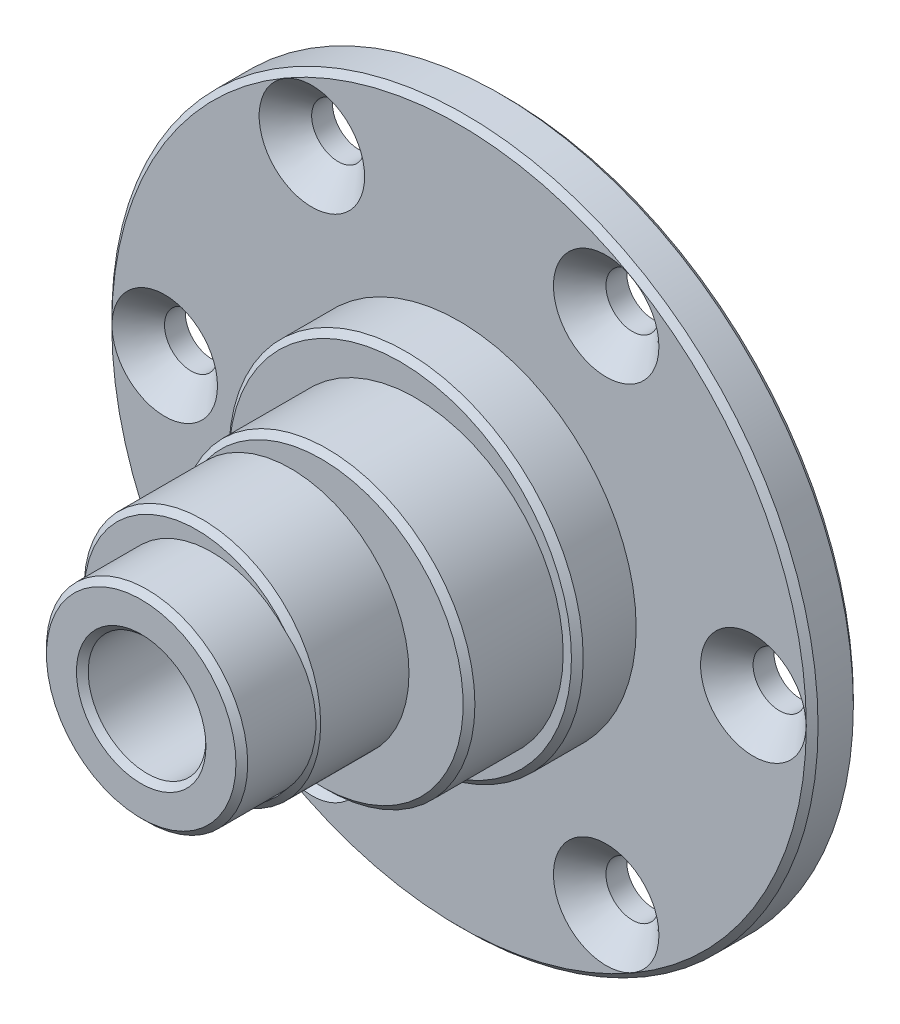
ISO-10303-21;
HEADER;
FILE_DESCRIPTION(('STEP AP214'),'2;1');
FILE_NAME('part.step','',(''),(''),'','','');
FILE_SCHEMA(('AUTOMOTIVE_DESIGN { 1 0 10303 214 1 1 1 1 }'));
ENDSEC;
DATA;
#1=APPLICATION_CONTEXT('core data for automotive mechanical design processes');
#2=APPLICATION_PROTOCOL_DEFINITION('international standard','automotive_design',2000,#1);
#3=PRODUCT_CONTEXT('',#1,'mechanical');
#4=PRODUCT('Part','Part','',(#3));
#5=PRODUCT_RELATED_PRODUCT_CATEGORY('part','',(#4));
#6=PRODUCT_DEFINITION_FORMATION('','',#4);
#7=PRODUCT_DEFINITION_CONTEXT('part definition',#1,'design');
#8=PRODUCT_DEFINITION('design','',#6,#7);
#9=PRODUCT_DEFINITION_SHAPE('','',#8);
#10=(LENGTH_UNIT() NAMED_UNIT(*) SI_UNIT(.MILLI.,.METRE.));
#11=(NAMED_UNIT(*) PLANE_ANGLE_UNIT() SI_UNIT($,.RADIAN.));
#12=(NAMED_UNIT(*) SI_UNIT($,.STERADIAN.) SOLID_ANGLE_UNIT());
#13=UNCERTAINTY_MEASURE_WITH_UNIT(LENGTH_MEASURE(1.E-05),#10,'distance_accuracy_value','');
#14=(GEOMETRIC_REPRESENTATION_CONTEXT(3) GLOBAL_UNCERTAINTY_ASSIGNED_CONTEXT((#13)) GLOBAL_UNIT_ASSIGNED_CONTEXT((#10,
#11,#12)) REPRESENTATION_CONTEXT('',''));
#15=CARTESIAN_POINT('',(0.,0.,0.));
#16=DIRECTION('',(0.,0.,1.));
#17=DIRECTION('',(1.,0.,0.));
#18=AXIS2_PLACEMENT_3D('',#15,#16,#17);
#19=CARTESIAN_POINT('',(0.,0.,4.));
#20=DIRECTION('',(0.,0.,-1.));
#21=DIRECTION('',(-1.,0.,0.));
#22=AXIS2_PLACEMENT_3D('',#19,#20,#21);
#23=CYLINDRICAL_SURFACE('',#22,30.);
#24=CARTESIAN_POINT('',(0.,0.,0.499999999999976));
#25=DIRECTION('',(0.,0.,1.));
#26=DIRECTION('',(1.,0.,0.));
#27=AXIS2_PLACEMENT_3D('',#24,#25,#26);
#28=CIRCLE('',#27,30.);
#29=CARTESIAN_POINT('',(30.,0.,0.499999999999976));
#30=VERTEX_POINT('',#29);
#31=EDGE_CURVE('E177',#30,#30,#28,.T.);
#32=ORIENTED_EDGE('',*,*,#31,.T.);
#33=EDGE_LOOP('',(#32));
#34=FACE_BOUND('',#33,.T.);
#35=CARTESIAN_POINT('',(0.,0.,3.50000000000002));
#36=DIRECTION('',(0.,0.,1.));
#37=DIRECTION('',(1.,0.,0.));
#38=AXIS2_PLACEMENT_3D('',#35,#36,#37);
#39=CIRCLE('',#38,30.);
#40=CARTESIAN_POINT('',(30.,0.,3.50000000000002));
#41=VERTEX_POINT('',#40);
#42=EDGE_CURVE('E173',#41,#41,#39,.F.);
#43=ORIENTED_EDGE('',*,*,#42,.T.);
#44=EDGE_LOOP('',(#43));
#45=FACE_BOUND('',#44,.T.);
#46=ADVANCED_FACE('F40',(#34,#45),#23,.T.);
#47=CARTESIAN_POINT('',(0.,0.,4.));
#48=DIRECTION('',(0.,0.,1.));
#49=DIRECTION('',(1.,0.,0.));
#50=AXIS2_PLACEMENT_3D('',#47,#48,#49);
#51=PLANE('',#50);
#52=CARTESIAN_POINT('',(0.,0.,4.));
#53=DIRECTION('',(0.,0.,1.));
#54=DIRECTION('',(1.,0.,0.));
#55=AXIS2_PLACEMENT_3D('',#52,#53,#54);
#56=CIRCLE('',#55,29.5);
#57=CARTESIAN_POINT('',(29.5,0.,4.));
#58=VERTEX_POINT('',#57);
#59=EDGE_CURVE('E181',#58,#58,#56,.T.);
#60=ORIENTED_EDGE('',*,*,#59,.T.);
#61=EDGE_LOOP('',(#60));
#62=FACE_BOUND('',#61,.T.);
#63=CARTESIAN_POINT('',(1.11022303054479E-13,4.19886323753594E-13,4.));
#64=DIRECTION('',(0.,0.,1.));
#65=DIRECTION('',(1.,0.,0.));
#66=AXIS2_PLACEMENT_3D('',#63,#64,#65);
#67=CIRCLE('',#66,15.0499999999998);
#68=CARTESIAN_POINT('',(15.0499999999999,4.19886323753594E-13,4.));
#69=VERTEX_POINT('',#68);
#70=EDGE_CURVE('E305',#69,#69,#67,.T.);
#71=ORIENTED_EDGE('',*,*,#70,.F.);
#72=EDGE_LOOP('',(#71));
#73=FACE_BOUND('',#72,.T.);
#74=CARTESIAN_POINT('',(-12.5,21.650635094611,4.));
#75=DIRECTION('',(0.,0.,1.));
#76=DIRECTION('',(1.,0.,0.));
#77=AXIS2_PLACEMENT_3D('',#74,#75,#76);
#78=CIRCLE('',#77,4.48);
#79=CARTESIAN_POINT('',(-8.02000000000003,21.650635094611,4.));
#80=VERTEX_POINT('',#79);
#81=EDGE_CURVE('E309',#80,#80,#78,.T.);
#82=ORIENTED_EDGE('',*,*,#81,.F.);
#83=EDGE_LOOP('',(#82));
#84=FACE_BOUND('',#83,.T.);
#85=CARTESIAN_POINT('',(12.5,21.650635094612,4.));
#86=DIRECTION('',(0.,0.,1.));
#87=DIRECTION('',(1.,0.,0.));
#88=AXIS2_PLACEMENT_3D('',#85,#86,#87);
#89=CIRCLE('',#88,4.48);
#90=CARTESIAN_POINT('',(16.98,21.650635094612,4.));
#91=VERTEX_POINT('',#90);
#92=EDGE_CURVE('E313',#91,#91,#89,.T.);
#93=ORIENTED_EDGE('',*,*,#92,.F.);
#94=EDGE_LOOP('',(#93));
#95=FACE_BOUND('',#94,.T.);
#96=CARTESIAN_POINT('',(25.0000000000009,1.61548103574623E-12,4.));
#97=DIRECTION('',(0.,0.,1.));
#98=DIRECTION('',(1.,0.,0.));
#99=AXIS2_PLACEMENT_3D('',#96,#97,#98);
#100=CIRCLE('',#99,4.48);
#101=CARTESIAN_POINT('',(29.4800000000009,1.61548103574623E-12,4.));
#102=VERTEX_POINT('',#101);
#103=EDGE_CURVE('E317',#102,#102,#100,.T.);
#104=ORIENTED_EDGE('',*,*,#103,.F.);
#105=EDGE_LOOP('',(#104));
#106=FACE_BOUND('',#105,.T.);
#107=CARTESIAN_POINT('',(-12.4999999999981,-21.650635094611,4.));
#108=DIRECTION('',(0.,0.,1.));
#109=DIRECTION('',(1.,0.,0.));
#110=AXIS2_PLACEMENT_3D('',#107,#108,#109);
#111=CIRCLE('',#110,4.48);
#112=CARTESIAN_POINT('',(-8.01999999999814,-21.650635094611,4.));
#113=VERTEX_POINT('',#112);
#114=EDGE_CURVE('E321',#113,#113,#111,.T.);
#115=ORIENTED_EDGE('',*,*,#114,.F.);
#116=EDGE_LOOP('',(#115));
#117=FACE_BOUND('',#116,.T.);
#118=CARTESIAN_POINT('',(12.5000000000019,-21.6506350946099,4.));
#119=DIRECTION('',(0.,0.,1.));
#120=DIRECTION('',(1.,0.,0.));
#121=AXIS2_PLACEMENT_3D('',#118,#119,#120);
#122=CIRCLE('',#121,4.48);
#123=CARTESIAN_POINT('',(16.9800000000019,-21.6506350946099,4.));
#124=VERTEX_POINT('',#123);
#125=EDGE_CURVE('E325',#124,#124,#122,.T.);
#126=ORIENTED_EDGE('',*,*,#125,.F.);
#127=EDGE_LOOP('',(#126));
#128=FACE_BOUND('',#127,.T.);
#129=CARTESIAN_POINT('',(-24.9999999999991,-5.68139501597432E-13,4.));
#130=DIRECTION('',(0.,0.,1.));
#131=DIRECTION('',(1.,0.,0.));
#132=AXIS2_PLACEMENT_3D('',#129,#130,#131);
#133=CIRCLE('',#132,4.48);
#134=CARTESIAN_POINT('',(-20.5199999999991,-5.68139501597432E-13,4.));
#135=VERTEX_POINT('',#134);
#136=EDGE_CURVE('E138',#135,#135,#133,.T.);
#137=ORIENTED_EDGE('',*,*,#136,.F.);
#138=EDGE_LOOP('',(#137));
#139=FACE_BOUND('',#138,.T.);
#140=ADVANCED_FACE('F248',(#62,#73,#84,#95,#106,#117,#128,#139),#51,.T.);
#141=CARTESIAN_POINT('',(0.,0.,0.));
#142=DIRECTION('',(0.,0.,1.));
#143=DIRECTION('',(1.,0.,0.));
#144=AXIS2_PLACEMENT_3D('',#141,#142,#143);
#145=PLANE('',#144);
#146=CARTESIAN_POINT('',(0.,0.,0.));
#147=DIRECTION('',(0.,0.,1.));
#148=DIRECTION('',(1.,0.,0.));
#149=AXIS2_PLACEMENT_3D('',#146,#147,#148);
#150=CIRCLE('',#149,12.5);
#151=CARTESIAN_POINT('',(12.5,0.,0.));
#152=VERTEX_POINT('',#151);
#153=EDGE_CURVE('E157',#152,#152,#150,.T.);
#154=ORIENTED_EDGE('',*,*,#153,.T.);
#155=EDGE_LOOP('',(#154));
#156=FACE_BOUND('',#155,.T.);
#157=CARTESIAN_POINT('',(0.,0.,0.));
#158=DIRECTION('',(0.,0.,1.));
#159=DIRECTION('',(1.,0.,0.));
#160=AXIS2_PLACEMENT_3D('',#157,#158,#159);
#161=CIRCLE('',#160,29.5);
#162=CARTESIAN_POINT('',(29.5,0.,0.));
#163=VERTEX_POINT('',#162);
#164=EDGE_CURVE('E153',#163,#163,#161,.F.);
#165=ORIENTED_EDGE('',*,*,#164,.T.);
#166=EDGE_LOOP('',(#165));
#167=FACE_BOUND('',#166,.T.);
#168=CARTESIAN_POINT('',(-12.5,21.650635094611,0.));
#169=DIRECTION('',(0.,0.,1.));
#170=DIRECTION('',(1.,0.,0.));
#171=AXIS2_PLACEMENT_3D('',#168,#169,#170);
#172=CIRCLE('',#171,2.24999999999999);
#173=CARTESIAN_POINT('',(-10.25,21.650635094611,0.));
#174=VERTEX_POINT('',#173);
#175=EDGE_CURVE('E370',#174,#174,#172,.T.);
#176=ORIENTED_EDGE('',*,*,#175,.T.);
#177=EDGE_LOOP('',(#176));
#178=FACE_BOUND('',#177,.T.);
#179=CARTESIAN_POINT('',(12.5,21.650635094612,0.));
#180=DIRECTION('',(0.,0.,1.));
#181=DIRECTION('',(1.,0.,0.));
#182=AXIS2_PLACEMENT_3D('',#179,#180,#181);
#183=CIRCLE('',#182,2.24999999999999);
#184=CARTESIAN_POINT('',(14.75,21.650635094612,0.));
#185=VERTEX_POINT('',#184);
#186=EDGE_CURVE('E360',#185,#185,#183,.T.);
#187=ORIENTED_EDGE('',*,*,#186,.T.);
#188=EDGE_LOOP('',(#187));
#189=FACE_BOUND('',#188,.T.);
#190=CARTESIAN_POINT('',(25.0000000000009,1.61548103574623E-12,0.));
#191=DIRECTION('',(0.,0.,1.));
#192=DIRECTION('',(1.,0.,0.));
#193=AXIS2_PLACEMENT_3D('',#190,#191,#192);
#194=CIRCLE('',#193,2.24999999999999);
#195=CARTESIAN_POINT('',(27.2500000000009,1.61548103574623E-12,0.));
#196=VERTEX_POINT('',#195);
#197=EDGE_CURVE('E351',#196,#196,#194,.T.);
#198=ORIENTED_EDGE('',*,*,#197,.T.);
#199=EDGE_LOOP('',(#198));
#200=FACE_BOUND('',#199,.T.);
#201=CARTESIAN_POINT('',(-12.4999999999981,-21.650635094611,0.));
#202=DIRECTION('',(0.,0.,1.));
#203=DIRECTION('',(1.,0.,0.));
#204=AXIS2_PLACEMENT_3D('',#201,#202,#203);
#205=CIRCLE('',#204,2.24999999999999);
#206=CARTESIAN_POINT('',(-10.2499999999981,-21.650635094611,0.));
#207=VERTEX_POINT('',#206);
#208=EDGE_CURVE('E341',#207,#207,#205,.T.);
#209=ORIENTED_EDGE('',*,*,#208,.T.);
#210=EDGE_LOOP('',(#209));
#211=FACE_BOUND('',#210,.T.);
#212=CARTESIAN_POINT('',(12.5000000000019,-21.6506350946099,0.));
#213=DIRECTION('',(0.,0.,1.));
#214=DIRECTION('',(1.,0.,0.));
#215=AXIS2_PLACEMENT_3D('',#212,#213,#214);
#216=CIRCLE('',#215,2.24999999999999);
#217=CARTESIAN_POINT('',(14.7500000000019,-21.6506350946099,0.));
#218=VERTEX_POINT('',#217);
#219=EDGE_CURVE('E330',#218,#218,#216,.T.);
#220=ORIENTED_EDGE('',*,*,#219,.T.);
#221=EDGE_LOOP('',(#220));
#222=FACE_BOUND('',#221,.T.);
#223=CARTESIAN_POINT('',(-24.9999999999991,-5.68139501597432E-13,0.));
#224=DIRECTION('',(0.,0.,1.));
#225=DIRECTION('',(1.,0.,0.));
#226=AXIS2_PLACEMENT_3D('',#223,#224,#225);
#227=CIRCLE('',#226,2.24999999999999);
#228=CARTESIAN_POINT('',(-22.7499999999991,-5.68139501597432E-13,0.));
#229=VERTEX_POINT('',#228);
#230=EDGE_CURVE('E122',#229,#229,#227,.T.);
#231=ORIENTED_EDGE('',*,*,#230,.T.);
#232=EDGE_LOOP('',(#231));
#233=FACE_BOUND('',#232,.T.);
#234=ADVANCED_FACE('F254',(#156,#167,#178,#189,#200,#211,#222,#233),#145,.F.);
#235=CARTESIAN_POINT('',(-24.9999999999991,-5.68139501597432E-13,4.));
#236=DIRECTION('',(0.,0.,1.));
#237=DIRECTION('',(1.,0.,0.));
#238=AXIS2_PLACEMENT_3D('',#235,#236,#237);
#239=CYLINDRICAL_SURFACE('',#238,2.24999999999999);
#240=ORIENTED_EDGE('',*,*,#230,.F.);
#241=EDGE_LOOP('',(#240));
#242=FACE_BOUND('',#241,.T.);
#243=CARTESIAN_POINT('',(-24.9999999999991,-5.68139501597432E-13,1.77));
#244=DIRECTION('',(0.,0.,1.));
#245=DIRECTION('',(1.,0.,0.));
#246=AXIS2_PLACEMENT_3D('',#243,#244,#245);
#247=CIRCLE('',#246,2.25);
#248=CARTESIAN_POINT('',(-22.7499999999991,-5.68139501597432E-13,1.77));
#249=VERTEX_POINT('',#248);
#250=EDGE_CURVE('E131',#249,#249,#247,.T.);
#251=ORIENTED_EDGE('',*,*,#250,.T.);
#252=EDGE_LOOP('',(#251));
#253=FACE_BOUND('',#252,.T.);
#254=ADVANCED_FACE('F464',(#242,#253),#239,.F.);
#255=CARTESIAN_POINT('',(-24.9999999999991,-5.68139501597432E-13,4.));
#256=DIRECTION('',(0.,0.,1.));
#257=DIRECTION('',(1.,0.,0.));
#258=AXIS2_PLACEMENT_3D('',#255,#256,#257);
#259=CONICAL_SURFACE('',#258,4.48,0.785398163397449);
#260=ORIENTED_EDGE('',*,*,#250,.F.);
#261=EDGE_LOOP('',(#260));
#262=FACE_BOUND('',#261,.T.);
#263=ORIENTED_EDGE('',*,*,#136,.T.);
#264=EDGE_LOOP('',(#263));
#265=FACE_BOUND('',#264,.T.);
#266=ADVANCED_FACE('F460',(#262,#265),#259,.F.);
#267=CARTESIAN_POINT('',(12.5000000000019,-21.6506350946099,4.));
#268=DIRECTION('',(0.,0.,1.));
#269=DIRECTION('',(1.,0.,0.));
#270=AXIS2_PLACEMENT_3D('',#267,#268,#269);
#271=CYLINDRICAL_SURFACE('',#270,2.24999999999999);
#272=ORIENTED_EDGE('',*,*,#219,.F.);
#273=EDGE_LOOP('',(#272));
#274=FACE_BOUND('',#273,.T.);
#275=CARTESIAN_POINT('',(12.5000000000019,-21.6506350946099,1.77));
#276=DIRECTION('',(0.,0.,1.));
#277=DIRECTION('',(1.,0.,0.));
#278=AXIS2_PLACEMENT_3D('',#275,#276,#277);
#279=CIRCLE('',#278,2.25);
#280=CARTESIAN_POINT('',(14.7500000000019,-21.6506350946099,1.77));
#281=VERTEX_POINT('',#280);
#282=EDGE_CURVE('E334',#281,#281,#279,.T.);
#283=ORIENTED_EDGE('',*,*,#282,.T.);
#284=EDGE_LOOP('',(#283));
#285=FACE_BOUND('',#284,.T.);
#286=ADVANCED_FACE('F456',(#274,#285),#271,.F.);
#287=CARTESIAN_POINT('',(12.5000000000019,-21.6506350946099,4.));
#288=DIRECTION('',(0.,0.,1.));
#289=DIRECTION('',(1.,0.,0.));
#290=AXIS2_PLACEMENT_3D('',#287,#288,#289);
#291=CONICAL_SURFACE('',#290,4.48,0.785398163397448);
#292=ORIENTED_EDGE('',*,*,#282,.F.);
#293=EDGE_LOOP('',(#292));
#294=FACE_BOUND('',#293,.T.);
#295=ORIENTED_EDGE('',*,*,#125,.T.);
#296=EDGE_LOOP('',(#295));
#297=FACE_BOUND('',#296,.T.);
#298=ADVANCED_FACE('F452',(#294,#297),#291,.F.);
#299=CARTESIAN_POINT('',(-12.4999999999981,-21.650635094611,4.));
#300=DIRECTION('',(0.,0.,1.));
#301=DIRECTION('',(1.,0.,0.));
#302=AXIS2_PLACEMENT_3D('',#299,#300,#301);
#303=CYLINDRICAL_SURFACE('',#302,2.24999999999999);
#304=ORIENTED_EDGE('',*,*,#208,.F.);
#305=EDGE_LOOP('',(#304));
#306=FACE_BOUND('',#305,.T.);
#307=CARTESIAN_POINT('',(-12.4999999999981,-21.650635094611,1.77));
#308=DIRECTION('',(0.,0.,1.));
#309=DIRECTION('',(1.,0.,0.));
#310=AXIS2_PLACEMENT_3D('',#307,#308,#309);
#311=CIRCLE('',#310,2.25);
#312=CARTESIAN_POINT('',(-10.2499999999981,-21.650635094611,1.77));
#313=VERTEX_POINT('',#312);
#314=EDGE_CURVE('E345',#313,#313,#311,.T.);
#315=ORIENTED_EDGE('',*,*,#314,.T.);
#316=EDGE_LOOP('',(#315));
#317=FACE_BOUND('',#316,.T.);
#318=ADVANCED_FACE('F448',(#306,#317),#303,.F.);
#319=CARTESIAN_POINT('',(-12.4999999999981,-21.650635094611,4.));
#320=DIRECTION('',(0.,0.,1.));
#321=DIRECTION('',(1.,0.,0.));
#322=AXIS2_PLACEMENT_3D('',#319,#320,#321);
#323=CONICAL_SURFACE('',#322,4.48,0.785398163397449);
#324=ORIENTED_EDGE('',*,*,#314,.F.);
#325=EDGE_LOOP('',(#324));
#326=FACE_BOUND('',#325,.T.);
#327=ORIENTED_EDGE('',*,*,#114,.T.);
#328=EDGE_LOOP('',(#327));
#329=FACE_BOUND('',#328,.T.);
#330=ADVANCED_FACE('F444',(#326,#329),#323,.F.);
#331=CARTESIAN_POINT('',(25.0000000000009,1.61548103574623E-12,4.));
#332=DIRECTION('',(0.,0.,1.));
#333=DIRECTION('',(1.,0.,0.));
#334=AXIS2_PLACEMENT_3D('',#331,#332,#333);
#335=CYLINDRICAL_SURFACE('',#334,2.24999999999999);
#336=ORIENTED_EDGE('',*,*,#197,.F.);
#337=EDGE_LOOP('',(#336));
#338=FACE_BOUND('',#337,.T.);
#339=CARTESIAN_POINT('',(25.0000000000009,1.61548103574623E-12,1.77));
#340=DIRECTION('',(0.,0.,1.));
#341=DIRECTION('',(1.,0.,0.));
#342=AXIS2_PLACEMENT_3D('',#339,#340,#341);
#343=CIRCLE('',#342,2.25);
#344=CARTESIAN_POINT('',(27.2500000000009,1.61548103574623E-12,1.77));
#345=VERTEX_POINT('',#344);
#346=EDGE_CURVE('E355',#345,#345,#343,.T.);
#347=ORIENTED_EDGE('',*,*,#346,.T.);
#348=EDGE_LOOP('',(#347));
#349=FACE_BOUND('',#348,.T.);
#350=ADVANCED_FACE('F440',(#338,#349),#335,.F.);
#351=CARTESIAN_POINT('',(25.0000000000009,1.61548103574623E-12,4.));
#352=DIRECTION('',(0.,0.,1.));
#353=DIRECTION('',(1.,0.,0.));
#354=AXIS2_PLACEMENT_3D('',#351,#352,#353);
#355=CONICAL_SURFACE('',#354,4.48,0.785398163397449);
#356=ORIENTED_EDGE('',*,*,#346,.F.);
#357=EDGE_LOOP('',(#356));
#358=FACE_BOUND('',#357,.T.);
#359=ORIENTED_EDGE('',*,*,#103,.T.);
#360=EDGE_LOOP('',(#359));
#361=FACE_BOUND('',#360,.T.);
#362=ADVANCED_FACE('F436',(#358,#361),#355,.F.);
#363=CARTESIAN_POINT('',(12.5,21.650635094612,4.));
#364=DIRECTION('',(0.,0.,1.));
#365=DIRECTION('',(1.,0.,0.));
#366=AXIS2_PLACEMENT_3D('',#363,#364,#365);
#367=CYLINDRICAL_SURFACE('',#366,2.24999999999999);
#368=ORIENTED_EDGE('',*,*,#186,.F.);
#369=EDGE_LOOP('',(#368));
#370=FACE_BOUND('',#369,.T.);
#371=CARTESIAN_POINT('',(12.5,21.650635094612,1.77));
#372=DIRECTION('',(0.,0.,1.));
#373=DIRECTION('',(1.,0.,0.));
#374=AXIS2_PLACEMENT_3D('',#371,#372,#373);
#375=CIRCLE('',#374,2.25);
#376=CARTESIAN_POINT('',(14.75,21.650635094612,1.77));
#377=VERTEX_POINT('',#376);
#378=EDGE_CURVE('E364',#377,#377,#375,.T.);
#379=ORIENTED_EDGE('',*,*,#378,.T.);
#380=EDGE_LOOP('',(#379));
#381=FACE_BOUND('',#380,.T.);
#382=ADVANCED_FACE('F432',(#370,#381),#367,.F.);
#383=CARTESIAN_POINT('',(12.5,21.650635094612,4.));
#384=DIRECTION('',(0.,0.,1.));
#385=DIRECTION('',(1.,0.,0.));
#386=AXIS2_PLACEMENT_3D('',#383,#384,#385);
#387=CONICAL_SURFACE('',#386,4.48,0.785398163397449);
#388=ORIENTED_EDGE('',*,*,#378,.F.);
#389=EDGE_LOOP('',(#388));
#390=FACE_BOUND('',#389,.T.);
#391=ORIENTED_EDGE('',*,*,#92,.T.);
#392=EDGE_LOOP('',(#391));
#393=FACE_BOUND('',#392,.T.);
#394=ADVANCED_FACE('F428',(#390,#393),#387,.F.);
#395=CARTESIAN_POINT('',(-12.5,21.650635094611,4.));
#396=DIRECTION('',(0.,0.,1.));
#397=DIRECTION('',(1.,0.,0.));
#398=AXIS2_PLACEMENT_3D('',#395,#396,#397);
#399=CYLINDRICAL_SURFACE('',#398,2.24999999999999);
#400=ORIENTED_EDGE('',*,*,#175,.F.);
#401=EDGE_LOOP('',(#400));
#402=FACE_BOUND('',#401,.T.);
#403=CARTESIAN_POINT('',(-12.5,21.650635094611,1.77));
#404=DIRECTION('',(0.,0.,1.));
#405=DIRECTION('',(1.,0.,0.));
#406=AXIS2_PLACEMENT_3D('',#403,#404,#405);
#407=CIRCLE('',#406,2.25);
#408=CARTESIAN_POINT('',(-10.25,21.650635094611,1.77));
#409=VERTEX_POINT('',#408);
#410=EDGE_CURVE('E374',#409,#409,#407,.T.);
#411=ORIENTED_EDGE('',*,*,#410,.T.);
#412=EDGE_LOOP('',(#411));
#413=FACE_BOUND('',#412,.T.);
#414=ADVANCED_FACE('F424',(#402,#413),#399,.F.);
#415=CARTESIAN_POINT('',(-12.5,21.650635094611,4.));
#416=DIRECTION('',(0.,0.,1.));
#417=DIRECTION('',(1.,0.,0.));
#418=AXIS2_PLACEMENT_3D('',#415,#416,#417);
#419=CONICAL_SURFACE('',#418,4.48,0.785398163397448);
#420=ORIENTED_EDGE('',*,*,#410,.F.);
#421=EDGE_LOOP('',(#420));
#422=FACE_BOUND('',#421,.T.);
#423=ORIENTED_EDGE('',*,*,#81,.T.);
#424=EDGE_LOOP('',(#423));
#425=FACE_BOUND('',#424,.T.);
#426=ADVANCED_FACE('F420',(#422,#425),#419,.F.);
#427=CARTESIAN_POINT('',(0.,0.,9.));
#428=DIRECTION('',(0.,0.,-1.));
#429=DIRECTION('',(-1.,0.,0.));
#430=AXIS2_PLACEMENT_3D('',#427,#428,#429);
#431=CYLINDRICAL_SURFACE('',#430,10.05);
#432=CARTESIAN_POINT('',(0.,0.,4.50000000000001));
#433=DIRECTION('',(0.,0.,-1.));
#434=DIRECTION('',(-1.,0.,0.));
#435=AXIS2_PLACEMENT_3D('',#432,#433,#434);
#436=CIRCLE('',#435,10.05);
#437=CARTESIAN_POINT('',(-10.05,0.,4.50000000000001));
#438=VERTEX_POINT('',#437);
#439=EDGE_CURVE('E128',#438,#438,#436,.T.);
#440=ORIENTED_EDGE('',*,*,#439,.T.);
#441=EDGE_LOOP('',(#440));
#442=FACE_BOUND('',#441,.T.);
#443=CARTESIAN_POINT('',(0.,0.,9.));
#444=DIRECTION('',(0.,0.,1.));
#445=DIRECTION('',(1.,0.,0.));
#446=AXIS2_PLACEMENT_3D('',#443,#444,#445);
#447=CIRCLE('',#446,10.05);
#448=CARTESIAN_POINT('',(10.05,0.,9.));
#449=VERTEX_POINT('',#448);
#450=EDGE_CURVE('E102',#449,#449,#447,.T.);
#451=ORIENTED_EDGE('',*,*,#450,.T.);
#452=EDGE_LOOP('',(#451));
#453=FACE_BOUND('',#452,.T.);
#454=ADVANCED_FACE('F389',(#442,#453),#431,.F.);
#455=CARTESIAN_POINT('',(1.11022303054479E-13,4.19886323753594E-13,9.));
#456=DIRECTION('',(0.,0.,-1.));
#457=DIRECTION('',(-1.,0.,0.));
#458=AXIS2_PLACEMENT_3D('',#455,#456,#457);
#459=CYLINDRICAL_SURFACE('',#458,15.0499999999998);
#460=CARTESIAN_POINT('',(1.11022303054479E-13,4.19886323753594E-13,8.50000000000001));
#461=DIRECTION('',(0.,0.,1.));
#462=DIRECTION('',(1.,0.,0.));
#463=AXIS2_PLACEMENT_3D('',#460,#461,#462);
#464=CIRCLE('',#463,15.0499999999998);
#465=CARTESIAN_POINT('',(15.0499999999999,4.19886323753594E-13,8.50000000000001));
#466=VERTEX_POINT('',#465);
#467=EDGE_CURVE('E188',#466,#466,#464,.F.);
#468=ORIENTED_EDGE('',*,*,#467,.T.);
#469=EDGE_LOOP('',(#468));
#470=FACE_BOUND('',#469,.T.);
#471=ORIENTED_EDGE('',*,*,#70,.T.);
#472=EDGE_LOOP('',(#471));
#473=FACE_BOUND('',#472,.T.);
#474=ADVANCED_FACE('F413',(#470,#473),#459,.T.);
#475=CARTESIAN_POINT('',(0.,0.,9.));
#476=DIRECTION('',(0.,0.,1.));
#477=DIRECTION('',(1.,0.,0.));
#478=AXIS2_PLACEMENT_3D('',#475,#476,#477);
#479=PLANE('',#478);
#480=CARTESIAN_POINT('',(1.11022303054479E-13,4.19886323753594E-13,9.));
#481=DIRECTION('',(0.,0.,1.));
#482=DIRECTION('',(1.,0.,0.));
#483=AXIS2_PLACEMENT_3D('',#480,#481,#482);
#484=CIRCLE('',#483,14.5499999999998);
#485=CARTESIAN_POINT('',(14.5499999999999,4.19886323753594E-13,9.));
#486=VERTEX_POINT('',#485);
#487=EDGE_CURVE('E185',#486,#486,#484,.T.);
#488=ORIENTED_EDGE('',*,*,#487,.T.);
#489=EDGE_LOOP('',(#488));
#490=FACE_BOUND('',#489,.T.);
#491=CARTESIAN_POINT('',(1.3,0.,9.));
#492=DIRECTION('',(0.,0.,1.));
#493=DIRECTION('',(1.,0.,0.));
#494=AXIS2_PLACEMENT_3D('',#491,#492,#493);
#495=CIRCLE('',#494,12.55);
#496=CARTESIAN_POINT('',(13.85,0.,9.));
#497=VERTEX_POINT('',#496);
#498=EDGE_CURVE('E103',#497,#497,#495,.T.);
#499=ORIENTED_EDGE('',*,*,#498,.F.);
#500=EDGE_LOOP('',(#499));
#501=FACE_BOUND('',#500,.T.);
#502=ADVANCED_FACE('F409',(#490,#501),#479,.T.);
#503=CARTESIAN_POINT('',(0.,0.,4.));
#504=DIRECTION('',(0.,0.,-1.));
#505=DIRECTION('',(-1.,0.,0.));
#506=AXIS2_PLACEMENT_3D('',#503,#504,#505);
#507=CYLINDRICAL_SURFACE('',#506,12.);
#508=CARTESIAN_POINT('',(0.,0.,0.49999999999998));
#509=DIRECTION('',(0.,0.,1.));
#510=DIRECTION('',(1.,0.,0.));
#511=AXIS2_PLACEMENT_3D('',#508,#509,#510);
#512=CIRCLE('',#511,12.);
#513=CARTESIAN_POINT('',(12.,0.,0.49999999999998));
#514=VERTEX_POINT('',#513);
#515=EDGE_CURVE('E149',#514,#514,#512,.F.);
#516=ORIENTED_EDGE('',*,*,#515,.T.);
#517=EDGE_LOOP('',(#516));
#518=FACE_BOUND('',#517,.T.);
#519=CARTESIAN_POINT('',(0.,0.,4.));
#520=DIRECTION('',(0.,0.,-1.));
#521=DIRECTION('',(-1.,0.,0.));
#522=AXIS2_PLACEMENT_3D('',#519,#520,#521);
#523=CIRCLE('',#522,12.);
#524=CARTESIAN_POINT('',(-12.,0.,4.));
#525=VERTEX_POINT('',#524);
#526=EDGE_CURVE('E382',#525,#525,#523,.T.);
#527=ORIENTED_EDGE('',*,*,#526,.F.);
#528=EDGE_LOOP('',(#527));
#529=FACE_BOUND('',#528,.T.);
#530=ADVANCED_FACE('F405',(#518,#529),#507,.F.);
#531=CARTESIAN_POINT('',(0.,0.,4.));
#532=DIRECTION('',(0.,0.,-1.));
#533=DIRECTION('',(-1.,0.,0.));
#534=AXIS2_PLACEMENT_3D('',#531,#532,#533);
#535=PLANE('',#534);
#536=CARTESIAN_POINT('',(0.,0.,4.));
#537=DIRECTION('',(0.,0.,-1.));
#538=DIRECTION('',(-1.,0.,0.));
#539=AXIS2_PLACEMENT_3D('',#536,#537,#538);
#540=CIRCLE('',#539,10.55);
#541=CARTESIAN_POINT('',(-10.55,0.,4.));
#542=VERTEX_POINT('',#541);
#543=EDGE_CURVE('E145',#542,#542,#540,.F.);
#544=ORIENTED_EDGE('',*,*,#543,.T.);
#545=EDGE_LOOP('',(#544));
#546=FACE_BOUND('',#545,.T.);
#547=ORIENTED_EDGE('',*,*,#526,.T.);
#548=EDGE_LOOP('',(#547));
#549=FACE_BOUND('',#548,.T.);
#550=ADVANCED_FACE('F402',(#546,#549),#535,.T.);
#551=CARTESIAN_POINT('',(1.3,0.,17.));
#552=DIRECTION('',(0.,0.,1.));
#553=DIRECTION('',(1.,0.,0.));
#554=AXIS2_PLACEMENT_3D('',#551,#552,#553);
#555=PLANE('',#554);
#556=CARTESIAN_POINT('',(-1.3,0.,17.));
#557=DIRECTION('',(0.,0.,1.));
#558=DIRECTION('',(1.,0.,0.));
#559=AXIS2_PLACEMENT_3D('',#556,#557,#558);
#560=CIRCLE('',#559,10.05);
#561=CARTESIAN_POINT('',(-8.50000000000009,-7.01159753551205,17.));
#562=VERTEX_POINT('',#561);
#563=CARTESIAN_POINT('',(-8.50000000000009,7.01159753551205,17.));
#564=VERTEX_POINT('',#563);
#565=EDGE_CURVE('E109',#562,#564,#560,.T.);
#566=ORIENTED_EDGE('',*,*,#565,.F.);
#567=CARTESIAN_POINT('',(1.3,0.,17.));
#568=DIRECTION('',(0.,0.,1.));
#569=DIRECTION('',(1.,0.,0.));
#570=AXIS2_PLACEMENT_3D('',#567,#568,#569);
#571=CIRCLE('',#570,12.05);
#572=EDGE_CURVE('E96',#562,#564,#571,.T.);
#573=ORIENTED_EDGE('',*,*,#572,.T.);
#574=EDGE_LOOP('',(#566,#573));
#575=FACE_BOUND('',#574,.T.);
#576=ADVANCED_FACE('F399',(#575),#555,.T.);
#577=CARTESIAN_POINT('',(1.3,0.,17.));
#578=DIRECTION('',(0.,0.,-1.));
#579=DIRECTION('',(-1.,0.,0.));
#580=AXIS2_PLACEMENT_3D('',#577,#578,#579);
#581=CYLINDRICAL_SURFACE('',#580,12.55);
#582=CARTESIAN_POINT('',(1.3,0.,17.));
#583=DIRECTION('',(0.,0.,1.));
#584=DIRECTION('',(1.,0.,0.));
#585=AXIS2_PLACEMENT_3D('',#582,#583,#584);
#586=CIRCLE('',#585,12.55);
#587=CARTESIAN_POINT('',(-10.8653846153846,3.08316674212778,17.));
#588=VERTEX_POINT('',#587);
#589=CARTESIAN_POINT('',(-10.8653846153846,-3.08316674212778,17.));
#590=VERTEX_POINT('',#589);
#591=EDGE_CURVE('E90',#588,#590,#586,.T.);
#592=ORIENTED_EDGE('',*,*,#591,.F.);
#593=DIRECTION('',(0.,0.,-1.));
#594=VECTOR('',#593,1.);
#595=CARTESIAN_POINT('',(-10.8653846153846,3.08316674212778,17.));
#596=LINE('',#595,#594);
#597=CARTESIAN_POINT('',(-10.8653846153847,3.08316674212772,16.5));
#598=VERTEX_POINT('',#597);
#599=EDGE_CURVE('E62',#588,#598,#596,.T.);
#600=ORIENTED_EDGE('',*,*,#599,.T.);
#601=CARTESIAN_POINT('',(1.3,0.,16.5));
#602=DIRECTION('',(0.,0.,1.));
#603=DIRECTION('',(1.,0.,0.));
#604=AXIS2_PLACEMENT_3D('',#601,#602,#603);
#605=CIRCLE('',#604,12.55);
#606=CARTESIAN_POINT('',(-10.8653846153847,-3.08316674212772,16.5));
#607=VERTEX_POINT('',#606);
#608=EDGE_CURVE('E93',#598,#607,#605,.F.);
#609=ORIENTED_EDGE('',*,*,#608,.T.);
#610=DIRECTION('',(0.,0.,-1.));
#611=VECTOR('',#610,1.);
#612=CARTESIAN_POINT('',(-10.8653846153847,-3.08316674212772,16.5));
#613=LINE('',#612,#611);
#614=EDGE_CURVE('E86',#607,#590,#613,.F.);
#615=ORIENTED_EDGE('',*,*,#614,.T.);
#616=EDGE_LOOP('',(#592,#600,#609,#615));
#617=FACE_BOUND('',#616,.T.);
#618=ORIENTED_EDGE('',*,*,#498,.T.);
#619=EDGE_LOOP('',(#618));
#620=FACE_BOUND('',#619,.T.);
#621=ADVANCED_FACE('F88',(#617,#620),#581,.T.);
#622=CARTESIAN_POINT('',(1.3,0.,9.));
#623=DIRECTION('',(0.,0.,1.));
#624=DIRECTION('',(1.,0.,0.));
#625=AXIS2_PLACEMENT_3D('',#622,#623,#624);
#626=PLANE('',#625);
#627=CARTESIAN_POINT('',(1.11022303054479E-13,4.19886323753594E-13,9.));
#628=DIRECTION('',(0.,0.,1.));
#629=DIRECTION('',(1.,0.,0.));
#630=AXIS2_PLACEMENT_3D('',#627,#628,#629);
#631=CIRCLE('',#630,4.99999999999977);
#632=CARTESIAN_POINT('',(4.99999999999989,4.19886323753594E-13,9.));
#633=VERTEX_POINT('',#632);
#634=EDGE_CURVE('E107',#633,#633,#631,.T.);
#635=ORIENTED_EDGE('',*,*,#634,.T.);
#636=EDGE_LOOP('',(#635));
#637=FACE_BOUND('',#636,.T.);
#638=ORIENTED_EDGE('',*,*,#450,.F.);
#639=EDGE_LOOP('',(#638));
#640=FACE_BOUND('',#639,.T.);
#641=ADVANCED_FACE('F391',(#637,#640),#626,.F.);
#642=CARTESIAN_POINT('',(-1.3,0.,17.));
#643=DIRECTION('',(0.,0.,1.));
#644=DIRECTION('',(1.,0.,0.));
#645=AXIS2_PLACEMENT_3D('',#642,#643,#644);
#646=PLANE('',#645);
#647=EDGE_CURVE('E100',#588,#590,#560,.T.);
#648=ORIENTED_EDGE('',*,*,#647,.F.);
#649=ORIENTED_EDGE('',*,*,#591,.T.);
#650=EDGE_LOOP('',(#648,#649));
#651=FACE_BOUND('',#650,.T.);
#652=ADVANCED_FACE('F99',(#651),#646,.F.);
#653=CARTESIAN_POINT('',(-1.3,0.,25.));
#654=DIRECTION('',(0.,0.,-1.));
#655=DIRECTION('',(-1.,0.,0.));
#656=AXIS2_PLACEMENT_3D('',#653,#654,#655);
#657=CYLINDRICAL_SURFACE('',#656,10.05);
#658=CARTESIAN_POINT('',(-1.3,0.,24.5));
#659=DIRECTION('',(0.,0.,1.));
#660=DIRECTION('',(1.,0.,0.));
#661=AXIS2_PLACEMENT_3D('',#658,#659,#660);
#662=CIRCLE('',#661,10.05);
#663=CARTESIAN_POINT('',(8.75,0.,24.5));
#664=VERTEX_POINT('',#663);
#665=EDGE_CURVE('E200',#664,#664,#662,.F.);
#666=ORIENTED_EDGE('',*,*,#665,.T.);
#667=EDGE_LOOP('',(#666));
#668=FACE_BOUND('',#667,.T.);
#669=ORIENTED_EDGE('',*,*,#647,.T.);
#670=ORIENTED_EDGE('',*,*,#614,.F.);
#671=CARTESIAN_POINT('',(-10.8653846153847,-3.08316674212772,16.5));
#672=CARTESIAN_POINT('',(-10.8168439192429,-3.23376143409689,16.5100564421892));
#673=CARTESIAN_POINT('',(-10.7647689518721,-3.38313963678237,16.5208567481953));
#674=CARTESIAN_POINT('',(-10.6536721951648,-3.67917392149907,16.5439322894588));
#675=CARTESIAN_POINT('',(-10.5946504144906,-3.82583000692432,16.5562075228771));
#676=CARTESIAN_POINT('',(-10.4073160501757,-4.26135444108909,16.5952329541381));
#677=CARTESIAN_POINT('',(-10.2687588122338,-4.54570345281121,16.6241778469502));
#678=CARTESIAN_POINT('',(-9.96905550489346,-5.09367142105833,16.6870491017528));
#679=CARTESIAN_POINT('',(-9.80845109093741,-5.35760220890766,16.7208567387474));
#680=CARTESIAN_POINT('',(-9.46412921785177,-5.86893180680696,16.7936834280177));
#681=CARTESIAN_POINT('',(-9.28043031185543,-6.11634364588725,16.832698298557));
#682=CARTESIAN_POINT('',(-8.99338654258726,-6.46806167645988,16.8939931973454));
#683=CARTESIAN_POINT('',(-8.89827672272486,-6.579524117621,16.9143510006218));
#684=CARTESIAN_POINT('',(-8.70288365566279,-6.79863673379339,16.9562852449599));
#685=CARTESIAN_POINT('',(-8.60257622116687,-6.90626424042858,16.9778674381127));
#686=CARTESIAN_POINT('',(-8.50000000000009,-7.01159753551205,17.));
#687=B_SPLINE_CURVE_WITH_KNOTS('',3,(#671,#672,#673,#674,#675,#676,#677,#678,#679,#680,#681,
#682,#683,#684,#685,#686),.UNSPECIFIED.,.F.,.F.,(4,2,2,2,2,2,2,4),(0.,0.475533153472189,
0.951065713992432,1.90236837584612,2.83348674359811,3.76386181394691,4.20754064436468,
4.65351147931166),.UNSPECIFIED.);
#688=EDGE_CURVE('E55',#607,#562,#687,.T.);
#689=ORIENTED_EDGE('',*,*,#688,.T.);
#690=ORIENTED_EDGE('',*,*,#565,.T.);
#691=CARTESIAN_POINT('',(-8.50000000000009,7.01159753551205,17.));
#692=CARTESIAN_POINT('',(-8.70944374127023,6.79658986665778,16.9548103375816));
#693=CARTESIAN_POINT('',(-8.90944324899634,6.57188111217812,16.9119097317971));
#694=CARTESIAN_POINT('',(-9.28902700940866,6.104779540741,16.83087181682));
#695=CARTESIAN_POINT('',(-9.46859726346155,5.86237478255025,16.7927377720489));
#696=CARTESIAN_POINT('',(-9.80203982352843,5.36704614962519,16.7222133906902));
#697=CARTESIAN_POINT('',(-9.95636485906399,5.11444133631222,16.6897210179189));
#698=CARTESIAN_POINT('',(-10.2422538216564,4.59630635128951,16.6297294668447));
#699=CARTESIAN_POINT('',(-10.3738348298747,4.33078607305736,16.6022265406046));
#700=CARTESIAN_POINT('',(-10.5636189102203,3.90102917188628,16.5626651544392));
#701=CARTESIAN_POINT('',(-10.6296519300481,3.74035709202866,16.5489257652043));
#702=CARTESIAN_POINT('',(-10.7537278262572,3.41468631070155,16.5231468446066));
#703=CARTESIAN_POINT('',(-10.8117191408002,3.24966709758872,16.5111182710878));
#704=CARTESIAN_POINT('',(-10.8653846153847,3.08316674212772,16.5));
#705=B_SPLINE_CURVE_WITH_KNOTS('',3,(#691,#692,#693,#694,#695,#696,#697,#698,#699,#700,#701,
#702,#703,#704),.UNSPECIFIED.,.F.,.F.,(4,2,2,2,2,2,4),(0.,0.910342661037879,1.82130540151772,
2.713524495068,3.60507057732523,4.12761538933128,4.65336939470845),.UNSPECIFIED.);
#706=EDGE_CURVE('E208',#564,#598,#705,.T.);
#707=ORIENTED_EDGE('',*,*,#706,.T.);
#708=ORIENTED_EDGE('',*,*,#599,.F.);
#709=EDGE_LOOP('',(#669,#670,#689,#690,#707,#708));
#710=FACE_BOUND('',#709,.T.);
#711=ADVANCED_FACE('F105',(#668,#710),#657,.T.);
#712=CARTESIAN_POINT('',(-1.3,0.,25.));
#713=DIRECTION('',(0.,0.,1.));
#714=DIRECTION('',(1.,0.,0.));
#715=AXIS2_PLACEMENT_3D('',#712,#713,#714);
#716=PLANE('',#715);
#717=CARTESIAN_POINT('',(0.,0.,25.));
#718=DIRECTION('',(0.,0.,1.));
#719=DIRECTION('',(1.,0.,0.));
#720=AXIS2_PLACEMENT_3D('',#717,#718,#719);
#721=CIRCLE('',#720,8.55);
#722=CARTESIAN_POINT('',(6.31153846153869,5.76775365705904,25.));
#723=VERTEX_POINT('',#722);
#724=CARTESIAN_POINT('',(6.31153846153869,-5.76775365705904,25.));
#725=VERTEX_POINT('',#724);
#726=EDGE_CURVE('E121',#723,#725,#721,.T.);
#727=ORIENTED_EDGE('',*,*,#726,.F.);
#728=CARTESIAN_POINT('',(-1.3,0.,25.));
#729=DIRECTION('',(0.,0.,1.));
#730=DIRECTION('',(1.,0.,0.));
#731=AXIS2_PLACEMENT_3D('',#728,#729,#730);
#732=CIRCLE('',#731,9.55000000000003);
#733=EDGE_CURVE('E198',#723,#725,#732,.T.);
#734=ORIENTED_EDGE('',*,*,#733,.T.);
#735=EDGE_LOOP('',(#727,#734));
#736=FACE_BOUND('',#735,.T.);
#737=ADVANCED_FACE('F660',(#736),#716,.T.);
#738=CARTESIAN_POINT('',(0.,0.,31.));
#739=DIRECTION('',(0.,0.,-1.));
#740=DIRECTION('',(-1.,0.,0.));
#741=AXIS2_PLACEMENT_3D('',#738,#739,#740);
#742=CYLINDRICAL_SURFACE('',#741,8.55);
#743=CARTESIAN_POINT('',(0.,0.,30.5));
#744=DIRECTION('',(0.,0.,1.));
#745=DIRECTION('',(1.,0.,0.));
#746=AXIS2_PLACEMENT_3D('',#743,#744,#745);
#747=CIRCLE('',#746,8.55);
#748=CARTESIAN_POINT('',(8.55,0.,30.5));
#749=VERTEX_POINT('',#748);
#750=EDGE_CURVE('E204',#749,#749,#747,.F.);
#751=ORIENTED_EDGE('',*,*,#750,.T.);
#752=EDGE_LOOP('',(#751));
#753=FACE_BOUND('',#752,.T.);
#754=ORIENTED_EDGE('',*,*,#726,.T.);
#755=CARTESIAN_POINT('',(6.31153846153869,-5.76775365705904,25.));
#756=CARTESIAN_POINT('',(6.47111710614996,-5.59316718013288,24.9782776428647));
#757=CARTESIAN_POINT('',(6.62347944003772,-5.41185461587011,24.9576109772506));
#758=CARTESIAN_POINT('',(6.91275785851748,-5.03708216265924,24.9184863505177));
#759=CARTESIAN_POINT('',(7.04967424323304,-4.8436225098497,24.9000283464829));
#760=CARTESIAN_POINT('',(7.30699932511608,-4.44593743863718,24.8654247864244));
#761=CARTESIAN_POINT('',(7.42741493668772,-4.24171657953362,24.849278261682));
#762=CARTESIAN_POINT('',(7.65093592752688,-3.82384820018469,24.8193701514155));
#763=CARTESIAN_POINT('',(7.754041517051,-3.6102007944789,24.8056085369229));
#764=CARTESIAN_POINT('',(7.94326660417687,-3.17246277663674,24.7803964273978));
#765=CARTESIAN_POINT('',(8.02917826968485,-2.94828065002701,24.7689741749661));
#766=CARTESIAN_POINT('',(8.18187844725436,-2.49337719664096,24.748699739299));
#767=CARTESIAN_POINT('',(8.24866654356499,-2.26265572781763,24.7398476119386));
#768=CARTESIAN_POINT('',(8.36259626263312,-1.79640179687986,24.7247617226183));
#769=CARTESIAN_POINT('',(8.40974383223431,-1.56087081370242,24.718527168094));
#770=CARTESIAN_POINT('',(8.48406448681512,-1.08662620787026,24.7087047689451));
#771=CARTESIAN_POINT('',(8.51123783186633,-0.84791262669531,24.7051168898598));
#772=CARTESIAN_POINT('',(8.54530417607078,-0.370437379341735,24.7006195178785));
#773=CARTESIAN_POINT('',(8.55231610968023,-0.131684339000246,24.6996943175083));
#774=CARTESIAN_POINT('',(8.5463462406631,0.345567084805338,24.7004822258771));
#775=CARTESIAN_POINT('',(8.5333644834068,0.584065468846078,24.7021953286291));
#776=CARTESIAN_POINT('',(8.48749603957269,1.05919563798426,24.7082522457959));
#777=CARTESIAN_POINT('',(8.45460198454797,1.29582669923508,24.7125970340532));
#778=CARTESIAN_POINT('',(8.36915015561535,1.76544165332552,24.7238958746661));
#779=CARTESIAN_POINT('',(8.31659287192924,1.99842563693917,24.730849861972));
#780=CARTESIAN_POINT('',(8.19226101952006,2.45889903511347,24.7473245288836));
#781=CARTESIAN_POINT('',(8.12050302710728,2.68639300547811,24.7568429945785));
#782=CARTESIAN_POINT('',(7.95828407175599,3.13448368360187,24.7784006073967));
#783=CARTESIAN_POINT('',(7.867823483826,3.35508052955418,24.7904397039785));
#784=CARTESIAN_POINT('',(7.66896482515082,3.78762267654912,24.8169642864245));
#785=CARTESIAN_POINT('',(7.56058396895267,3.99957603942195,24.8314474247685));
#786=CARTESIAN_POINT('',(7.32666123712607,4.41350485787157,24.8627886100652));
#787=CARTESIAN_POINT('',(7.20112618244516,4.61548423611926,24.8796457131499));
#788=CARTESIAN_POINT('',(6.95286972805768,4.98011629127853,24.9130814266449));
#789=CARTESIAN_POINT('',(6.8323020564487,5.14426851741382,24.9293566587911));
#790=CARTESIAN_POINT('',(6.58009266441822,5.46316603575205,24.963497469271));
#791=CARTESIAN_POINT('',(6.44847162602024,5.61792800266097,24.9813600809411));
#792=CARTESIAN_POINT('',(6.31153846153869,5.76775365705904,25.));
#793=B_SPLINE_CURVE_WITH_KNOTS('',3,(#755,#756,#757,#758,#759,#760,#761,#762,#763,#764,#765,
#766,#767,#768,#769,#770,#771,#772,#773,#774,#775,#776,#777,#778,#779,#780,#781,#782,#783,#784,
#785,#786,#787,#788,#789,#790,#791,#792),.UNSPECIFIED.,.F.,.F.,(4,2,2,2,2,2,2,2,2,2,2,2,2,2,2,2,
2,2,4),(0.,0.712366200441907,1.42471855681865,2.13677149369873,2.84881578098514,
3.56900649545541,4.28921286585282,5.00920101026812,5.72917978001217,6.44490251117532,
7.1606236182018,7.87660973630895,8.59257800543445,9.30793014975113,10.0232679518266,
10.7379225372319,11.4522937801378,12.0647474039485,12.6760795597738),.UNSPECIFIED.);
#794=EDGE_CURVE('E11',#725,#723,#793,.T.);
#795=ORIENTED_EDGE('',*,*,#794,.T.);
#796=EDGE_LOOP('',(#754,#795));
#797=FACE_BOUND('',#796,.T.);
#798=ADVANCED_FACE('F669',(#753,#797),#742,.T.);
#799=CARTESIAN_POINT('',(0.,0.,31.));
#800=DIRECTION('',(0.,0.,1.));
#801=DIRECTION('',(1.,0.,0.));
#802=AXIS2_PLACEMENT_3D('',#799,#800,#801);
#803=PLANE('',#802);
#804=CARTESIAN_POINT('',(1.11022303054479E-13,4.19886323753594E-13,31.));
#805=DIRECTION('',(0.,0.,1.));
#806=DIRECTION('',(1.,0.,0.));
#807=AXIS2_PLACEMENT_3D('',#804,#805,#806);
#808=CIRCLE('',#807,5.49999999999974);
#809=CARTESIAN_POINT('',(5.49999999999985,4.19886323753594E-13,31.));
#810=VERTEX_POINT('',#809);
#811=EDGE_CURVE('E169',#810,#810,#808,.F.);
#812=ORIENTED_EDGE('',*,*,#811,.T.);
#813=EDGE_LOOP('',(#812));
#814=FACE_BOUND('',#813,.T.);
#815=CARTESIAN_POINT('',(0.,0.,31.));
#816=DIRECTION('',(0.,0.,1.));
#817=DIRECTION('',(1.,0.,0.));
#818=AXIS2_PLACEMENT_3D('',#815,#816,#817);
#819=CIRCLE('',#818,8.05000000000001);
#820=CARTESIAN_POINT('',(8.05000000000001,0.,31.));
#821=VERTEX_POINT('',#820);
#822=EDGE_CURVE('E165',#821,#821,#819,.T.);
#823=ORIENTED_EDGE('',*,*,#822,.T.);
#824=EDGE_LOOP('',(#823));
#825=FACE_BOUND('',#824,.T.);
#826=ADVANCED_FACE('F679',(#814,#825),#803,.T.);
#827=CARTESIAN_POINT('',(1.11022303054479E-13,4.19886323753594E-13,0.999999999999987));
#828=DIRECTION('',(0.,0.,1.));
#829=DIRECTION('',(1.,0.,0.));
#830=AXIS2_PLACEMENT_3D('',#827,#828,#829);
#831=CYLINDRICAL_SURFACE('',#830,4.99999999999977);
#832=CARTESIAN_POINT('',(1.11022303054479E-13,4.19886323753594E-13,30.5));
#833=DIRECTION('',(0.,0.,1.));
#834=DIRECTION('',(1.,0.,0.));
#835=AXIS2_PLACEMENT_3D('',#832,#833,#834);
#836=CIRCLE('',#835,4.99999999999977);
#837=CARTESIAN_POINT('',(4.99999999999989,4.19886323753594E-13,30.5));
#838=VERTEX_POINT('',#837);
#839=EDGE_CURVE('E161',#838,#838,#836,.T.);
#840=ORIENTED_EDGE('',*,*,#839,.T.);
#841=EDGE_LOOP('',(#840));
#842=FACE_BOUND('',#841,.T.);
#843=ORIENTED_EDGE('',*,*,#634,.F.);
#844=EDGE_LOOP('',(#843));
#845=FACE_BOUND('',#844,.T.);
#846=ADVANCED_FACE('F268',(#842,#845),#831,.F.);
#847=CARTESIAN_POINT('',(0.,0.,4.50000000000001));
#848=DIRECTION('',(0.,0.,-1.));
#849=DIRECTION('',(-1.,0.,0.));
#850=AXIS2_PLACEMENT_3D('',#847,#848,#849);
#851=CONICAL_SURFACE('',#850,10.05,0.785398163397441);
#852=ORIENTED_EDGE('',*,*,#543,.F.);
#853=EDGE_LOOP('',(#852));
#854=FACE_BOUND('',#853,.T.);
#855=ORIENTED_EDGE('',*,*,#439,.F.);
#856=EDGE_LOOP('',(#855));
#857=FACE_BOUND('',#856,.T.);
#858=ADVANCED_FACE('F261',(#854,#857),#851,.F.);
#859=CARTESIAN_POINT('',(0.,0.,0.49999999999998));
#860=DIRECTION('',(0.,0.,-1.));
#861=DIRECTION('',(-1.,0.,0.));
#862=AXIS2_PLACEMENT_3D('',#859,#860,#861);
#863=CONICAL_SURFACE('',#862,12.,0.78539816339745);
#864=ORIENTED_EDGE('',*,*,#153,.F.);
#865=EDGE_LOOP('',(#864));
#866=FACE_BOUND('',#865,.T.);
#867=ORIENTED_EDGE('',*,*,#515,.F.);
#868=EDGE_LOOP('',(#867));
#869=FACE_BOUND('',#868,.T.);
#870=ADVANCED_FACE('F267',(#866,#869),#863,.F.);
#871=CARTESIAN_POINT('',(1.11022303054479E-13,4.19886323753594E-13,30.5));
#872=DIRECTION('',(0.,0.,1.));
#873=DIRECTION('',(1.,0.,0.));
#874=AXIS2_PLACEMENT_3D('',#871,#872,#873);
#875=CONICAL_SURFACE('',#874,4.99999999999977,0.785398163397453);
#876=ORIENTED_EDGE('',*,*,#811,.F.);
#877=EDGE_LOOP('',(#876));
#878=FACE_BOUND('',#877,.T.);
#879=ORIENTED_EDGE('',*,*,#839,.F.);
#880=EDGE_LOOP('',(#879));
#881=FACE_BOUND('',#880,.T.);
#882=ADVANCED_FACE('F275',(#878,#881),#875,.F.);
#883=CARTESIAN_POINT('',(0.,0.,0.499999999999976));
#884=DIRECTION('',(0.,0.,1.));
#885=DIRECTION('',(1.,0.,0.));
#886=AXIS2_PLACEMENT_3D('',#883,#884,#885);
#887=CONICAL_SURFACE('',#886,30.,0.785398163397448);
#888=ORIENTED_EDGE('',*,*,#164,.F.);
#889=EDGE_LOOP('',(#888));
#890=FACE_BOUND('',#889,.T.);
#891=ORIENTED_EDGE('',*,*,#31,.F.);
#892=EDGE_LOOP('',(#891));
#893=FACE_BOUND('',#892,.T.);
#894=ADVANCED_FACE('F282',(#890,#893),#887,.T.);
#895=CARTESIAN_POINT('',(0.,0.,4.));
#896=DIRECTION('',(0.,0.,-1.));
#897=DIRECTION('',(-1.,0.,0.));
#898=AXIS2_PLACEMENT_3D('',#895,#896,#897);
#899=CONICAL_SURFACE('',#898,29.5,0.785398163397441);
#900=ORIENTED_EDGE('',*,*,#42,.F.);
#901=EDGE_LOOP('',(#900));
#902=FACE_BOUND('',#901,.T.);
#903=ORIENTED_EDGE('',*,*,#59,.F.);
#904=EDGE_LOOP('',(#903));
#905=FACE_BOUND('',#904,.T.);
#906=ADVANCED_FACE('F288',(#902,#905),#899,.T.);
#907=CARTESIAN_POINT('',(1.11022303054479E-13,4.19886323753594E-13,9.));
#908=DIRECTION('',(0.,0.,-1.));
#909=DIRECTION('',(-1.,0.,0.));
#910=AXIS2_PLACEMENT_3D('',#907,#908,#909);
#911=CONICAL_SURFACE('',#910,14.5499999999998,0.785398163397462);
#912=ORIENTED_EDGE('',*,*,#467,.F.);
#913=EDGE_LOOP('',(#912));
#914=FACE_BOUND('',#913,.T.);
#915=ORIENTED_EDGE('',*,*,#487,.F.);
#916=EDGE_LOOP('',(#915));
#917=FACE_BOUND('',#916,.T.);
#918=ADVANCED_FACE('F233',(#914,#917),#911,.T.);
#919=CARTESIAN_POINT('',(1.3,0.,17.));
#920=DIRECTION('',(0.,0.,-1.));
#921=DIRECTION('',(-1.,0.,0.));
#922=AXIS2_PLACEMENT_3D('',#919,#920,#921);
#923=CONICAL_SURFACE('',#922,12.05,0.78539816339745);
#924=ORIENTED_EDGE('',*,*,#688,.F.);
#925=ORIENTED_EDGE('',*,*,#608,.F.);
#926=ORIENTED_EDGE('',*,*,#706,.F.);
#927=ORIENTED_EDGE('',*,*,#572,.F.);
#928=EDGE_LOOP('',(#924,#925,#926,#927));
#929=FACE_BOUND('',#928,.T.);
#930=ADVANCED_FACE('F224',(#929),#923,.T.);
#931=CARTESIAN_POINT('',(-1.3,0.,25.));
#932=DIRECTION('',(0.,0.,-1.));
#933=DIRECTION('',(-1.,0.,0.));
#934=AXIS2_PLACEMENT_3D('',#931,#932,#933);
#935=CONICAL_SURFACE('',#934,9.55000000000003,0.785398163397443);
#936=ORIENTED_EDGE('',*,*,#665,.F.);
#937=EDGE_LOOP('',(#936));
#938=FACE_BOUND('',#937,.T.);
#939=ORIENTED_EDGE('',*,*,#794,.F.);
#940=ORIENTED_EDGE('',*,*,#733,.F.);
#941=EDGE_LOOP('',(#939,#940));
#942=FACE_BOUND('',#941,.T.);
#943=ADVANCED_FACE('F232',(#938,#942),#935,.T.);
#944=CARTESIAN_POINT('',(0.,0.,31.));
#945=DIRECTION('',(0.,0.,-1.));
#946=DIRECTION('',(-1.,0.,0.));
#947=AXIS2_PLACEMENT_3D('',#944,#945,#946);
#948=CONICAL_SURFACE('',#947,8.05000000000001,0.785398163397447);
#949=ORIENTED_EDGE('',*,*,#750,.F.);
#950=EDGE_LOOP('',(#949));
#951=FACE_BOUND('',#950,.T.);
#952=ORIENTED_EDGE('',*,*,#822,.F.);
#953=EDGE_LOOP('',(#952));
#954=FACE_BOUND('',#953,.T.);
#955=ADVANCED_FACE('F43',(#951,#954),#948,.T.);
#956=CLOSED_SHELL('',(#46,#140,#234,#254,#266,#286,#298,#318,#330,#350,#362,#382,#394,#414,#426,
#454,#474,#502,#530,#550,#576,#621,#641,#652,#711,#737,#798,#826,#846,#858,#870,#882,#894,#906,
#918,#930,#943,#955));
#957=MANIFOLD_SOLID_BREP('B2',#956);
#958=ADVANCED_BREP_SHAPE_REPRESENTATION('',(#18,#957),#14);
#959=SHAPE_DEFINITION_REPRESENTATION(#9,#958);
ENDSEC;
END-ISO-10303-21;
